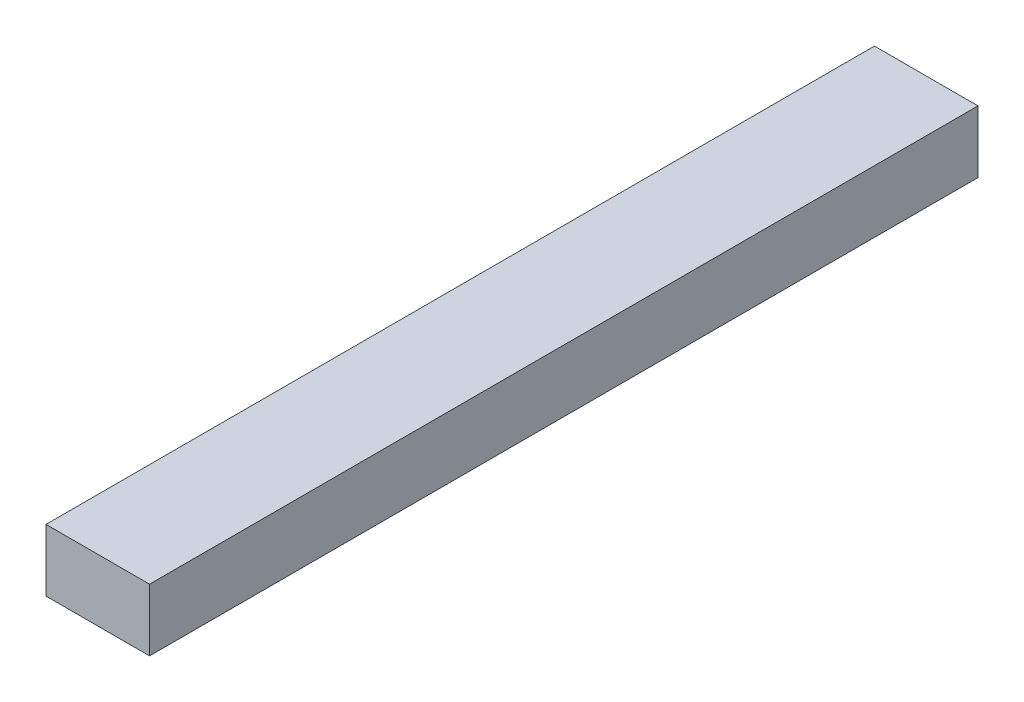
ISO-10303-21;
HEADER;
FILE_DESCRIPTION(('STEP AP214'),'2;1');
FILE_NAME('part.step','',(''),(''),'','','');
FILE_SCHEMA(('AUTOMOTIVE_DESIGN { 1 0 10303 214 1 1 1 1 }'));
ENDSEC;
DATA;
#1=APPLICATION_CONTEXT('core data for automotive mechanical design processes');
#2=APPLICATION_PROTOCOL_DEFINITION('international standard','automotive_design',2000,#1);
#3=PRODUCT_CONTEXT('',#1,'mechanical');
#4=PRODUCT('Part','Part','',(#3));
#5=PRODUCT_RELATED_PRODUCT_CATEGORY('part','',(#4));
#6=PRODUCT_DEFINITION_FORMATION('','',#4);
#7=PRODUCT_DEFINITION_CONTEXT('part definition',#1,'design');
#8=PRODUCT_DEFINITION('design','',#6,#7);
#9=PRODUCT_DEFINITION_SHAPE('','',#8);
#10=(LENGTH_UNIT() NAMED_UNIT(*) SI_UNIT(.MILLI.,.METRE.));
#11=(NAMED_UNIT(*) PLANE_ANGLE_UNIT() SI_UNIT($,.RADIAN.));
#12=(NAMED_UNIT(*) SI_UNIT($,.STERADIAN.) SOLID_ANGLE_UNIT());
#13=UNCERTAINTY_MEASURE_WITH_UNIT(LENGTH_MEASURE(1.E-05),#10,'distance_accuracy_value','');
#14=(GEOMETRIC_REPRESENTATION_CONTEXT(3) GLOBAL_UNCERTAINTY_ASSIGNED_CONTEXT((#13)) GLOBAL_UNIT_ASSIGNED_CONTEXT((#10,
#11,#12)) REPRESENTATION_CONTEXT('',''));
#15=CARTESIAN_POINT('',(0.,0.,0.));
#16=DIRECTION('',(0.,0.,1.));
#17=DIRECTION('',(1.,0.,0.));
#18=AXIS2_PLACEMENT_3D('',#15,#16,#17);
#19=CARTESIAN_POINT('',(-50.,30.,800.));
#20=DIRECTION('',(1.,0.,0.));
#21=DIRECTION('',(0.,1.,0.));
#22=AXIS2_PLACEMENT_3D('',#19,#20,#21);
#23=PLANE('',#22);
#24=DIRECTION('',(0.,-1.,0.));
#25=VECTOR('',#24,1.);
#26=CARTESIAN_POINT('',(-50.,30.,0.));
#27=LINE('',#26,#25);
#28=CARTESIAN_POINT('',(-50.,30.,0.));
#29=VERTEX_POINT('',#28);
#30=CARTESIAN_POINT('',(-50.,-30.,0.));
#31=VERTEX_POINT('',#30);
#32=EDGE_CURVE('E96',#29,#31,#27,.T.);
#33=ORIENTED_EDGE('',*,*,#32,.T.);
#34=DIRECTION('',(0.,0.,-1.));
#35=VECTOR('',#34,1.);
#36=CARTESIAN_POINT('',(-50.,-30.,800.));
#37=LINE('',#36,#35);
#38=CARTESIAN_POINT('',(-50.,-30.,800.));
#39=VERTEX_POINT('',#38);
#40=EDGE_CURVE('E11',#39,#31,#37,.T.);
#41=ORIENTED_EDGE('',*,*,#40,.F.);
#42=DIRECTION('',(0.,-1.,0.));
#43=VECTOR('',#42,1.);
#44=CARTESIAN_POINT('',(-50.,30.,800.));
#45=LINE('',#44,#43);
#46=CARTESIAN_POINT('',(-50.,30.,800.));
#47=VERTEX_POINT('',#46);
#48=EDGE_CURVE('E84',#47,#39,#45,.T.);
#49=ORIENTED_EDGE('',*,*,#48,.F.);
#50=DIRECTION('',(0.,0.,-1.));
#51=VECTOR('',#50,1.);
#52=CARTESIAN_POINT('',(-50.,30.,800.));
#53=LINE('',#52,#51);
#54=EDGE_CURVE('E92',#47,#29,#53,.T.);
#55=ORIENTED_EDGE('',*,*,#54,.T.);
#56=EDGE_LOOP('',(#33,#41,#49,#55));
#57=FACE_BOUND('',#56,.T.);
#58=ADVANCED_FACE('F33',(#57),#23,.F.);
#59=CARTESIAN_POINT('',(50.,-30.,800.));
#60=DIRECTION('',(0.,1.,0.));
#61=DIRECTION('',(-1.,0.,0.));
#62=AXIS2_PLACEMENT_3D('',#59,#60,#61);
#63=PLANE('',#62);
#64=DIRECTION('',(1.,0.,0.));
#65=VECTOR('',#64,1.);
#66=CARTESIAN_POINT('',(50.,-30.,0.));
#67=LINE('',#66,#65);
#68=CARTESIAN_POINT('',(50.,-30.,0.));
#69=VERTEX_POINT('',#68);
#70=EDGE_CURVE('E88',#31,#69,#67,.T.);
#71=ORIENTED_EDGE('',*,*,#70,.T.);
#72=DIRECTION('',(0.,0.,-1.));
#73=VECTOR('',#72,1.);
#74=CARTESIAN_POINT('',(50.,-30.,800.));
#75=LINE('',#74,#73);
#76=CARTESIAN_POINT('',(50.,-30.,800.));
#77=VERTEX_POINT('',#76);
#78=EDGE_CURVE('E41',#77,#69,#75,.T.);
#79=ORIENTED_EDGE('',*,*,#78,.F.);
#80=DIRECTION('',(1.,0.,0.));
#81=VECTOR('',#80,1.);
#82=CARTESIAN_POINT('',(50.,-30.,800.));
#83=LINE('',#82,#81);
#84=EDGE_CURVE('E79',#39,#77,#83,.T.);
#85=ORIENTED_EDGE('',*,*,#84,.F.);
#86=ORIENTED_EDGE('',*,*,#40,.T.);
#87=EDGE_LOOP('',(#71,#79,#85,#86));
#88=FACE_BOUND('',#87,.T.);
#89=ADVANCED_FACE('F87',(#88),#63,.F.);
#90=CARTESIAN_POINT('',(50.,30.,800.));
#91=DIRECTION('',(-1.,0.,0.));
#92=DIRECTION('',(0.,-1.,0.));
#93=AXIS2_PLACEMENT_3D('',#90,#91,#92);
#94=PLANE('',#93);
#95=DIRECTION('',(0.,1.,0.));
#96=VECTOR('',#95,1.);
#97=CARTESIAN_POINT('',(50.,30.,0.));
#98=LINE('',#97,#96);
#99=CARTESIAN_POINT('',(50.,30.,0.));
#100=VERTEX_POINT('',#99);
#101=EDGE_CURVE('E66',#69,#100,#98,.T.);
#102=ORIENTED_EDGE('',*,*,#101,.T.);
#103=DIRECTION('',(0.,0.,-1.));
#104=VECTOR('',#103,1.);
#105=CARTESIAN_POINT('',(50.,30.,800.));
#106=LINE('',#105,#104);
#107=CARTESIAN_POINT('',(50.,30.,800.));
#108=VERTEX_POINT('',#107);
#109=EDGE_CURVE('E89',#108,#100,#106,.T.);
#110=ORIENTED_EDGE('',*,*,#109,.F.);
#111=DIRECTION('',(0.,1.,0.));
#112=VECTOR('',#111,1.);
#113=CARTESIAN_POINT('',(50.,30.,800.));
#114=LINE('',#113,#112);
#115=EDGE_CURVE('E82',#77,#108,#114,.T.);
#116=ORIENTED_EDGE('',*,*,#115,.F.);
#117=ORIENTED_EDGE('',*,*,#78,.T.);
#118=EDGE_LOOP('',(#102,#110,#116,#117));
#119=FACE_BOUND('',#118,.T.);
#120=ADVANCED_FACE('F90',(#119),#94,.F.);
#121=CARTESIAN_POINT('',(50.,30.,800.));
#122=DIRECTION('',(0.,-1.,0.));
#123=DIRECTION('',(1.,0.,0.));
#124=AXIS2_PLACEMENT_3D('',#121,#122,#123);
#125=PLANE('',#124);
#126=DIRECTION('',(-1.,0.,0.));
#127=VECTOR('',#126,1.);
#128=CARTESIAN_POINT('',(50.,30.,0.));
#129=LINE('',#128,#127);
#130=EDGE_CURVE('E72',#100,#29,#129,.T.);
#131=ORIENTED_EDGE('',*,*,#130,.T.);
#132=ORIENTED_EDGE('',*,*,#54,.F.);
#133=DIRECTION('',(-1.,0.,0.));
#134=VECTOR('',#133,1.);
#135=CARTESIAN_POINT('',(50.,30.,800.));
#136=LINE('',#135,#134);
#137=EDGE_CURVE('E49',#108,#47,#136,.T.);
#138=ORIENTED_EDGE('',*,*,#137,.F.);
#139=ORIENTED_EDGE('',*,*,#109,.T.);
#140=EDGE_LOOP('',(#131,#132,#138,#139));
#141=FACE_BOUND('',#140,.T.);
#142=ADVANCED_FACE('F103',(#141),#125,.F.);
#143=CARTESIAN_POINT('',(0.,0.,800.));
#144=DIRECTION('',(0.,0.,-1.));
#145=DIRECTION('',(-1.,0.,0.));
#146=AXIS2_PLACEMENT_3D('',#143,#144,#145);
#147=PLANE('',#146);
#148=ORIENTED_EDGE('',*,*,#48,.T.);
#149=ORIENTED_EDGE('',*,*,#84,.T.);
#150=ORIENTED_EDGE('',*,*,#115,.T.);
#151=ORIENTED_EDGE('',*,*,#137,.T.);
#152=EDGE_LOOP('',(#148,#149,#150,#151));
#153=FACE_BOUND('',#152,.T.);
#154=ADVANCED_FACE('F80',(#153),#147,.F.);
#155=CARTESIAN_POINT('',(0.,0.,0.));
#156=DIRECTION('',(0.,0.,-1.));
#157=DIRECTION('',(-1.,0.,0.));
#158=AXIS2_PLACEMENT_3D('',#155,#156,#157);
#159=PLANE('',#158);
#160=ORIENTED_EDGE('',*,*,#32,.F.);
#161=ORIENTED_EDGE('',*,*,#130,.F.);
#162=ORIENTED_EDGE('',*,*,#101,.F.);
#163=ORIENTED_EDGE('',*,*,#70,.F.);
#164=EDGE_LOOP('',(#160,#161,#162,#163));
#165=FACE_BOUND('',#164,.T.);
#166=ADVANCED_FACE('F106',(#165),#159,.T.);
#167=CLOSED_SHELL('',(#58,#89,#120,#142,#154,#166));
#168=MANIFOLD_SOLID_BREP('B2',#167);
#169=ADVANCED_BREP_SHAPE_REPRESENTATION('',(#18,#168),#14);
#170=SHAPE_DEFINITION_REPRESENTATION(#9,#169);
ENDSEC;
END-ISO-10303-21;
